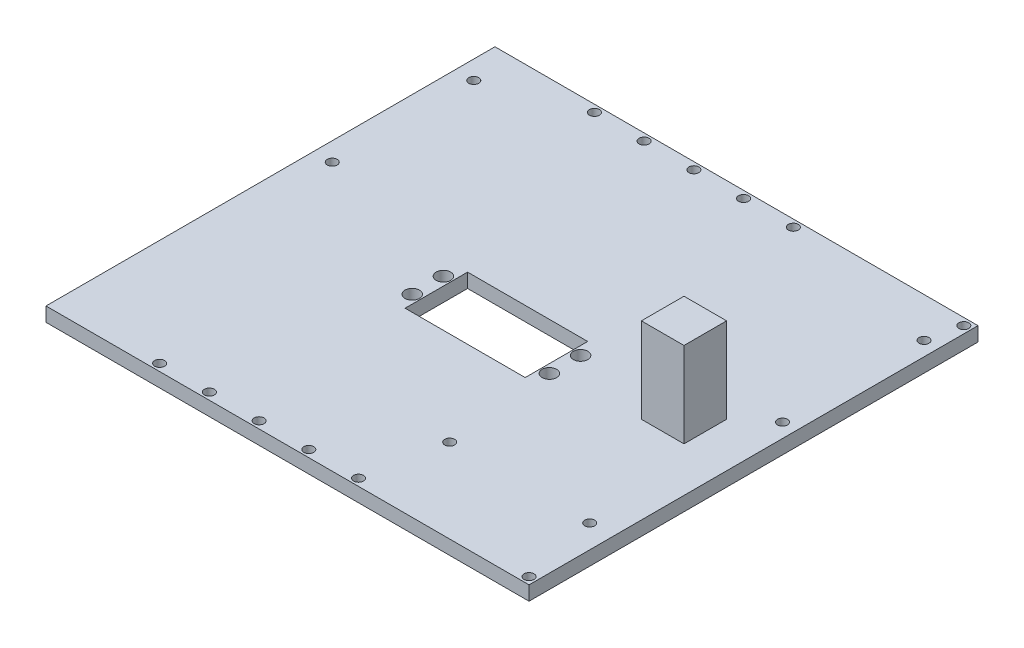
ISO-10303-21;
HEADER;
FILE_DESCRIPTION(('STEP AP214'),'2;1');
FILE_NAME('part.step','',(''),(''),'','','');
FILE_SCHEMA(('AUTOMOTIVE_DESIGN { 1 0 10303 214 1 1 1 1 }'));
ENDSEC;
DATA;
#1=APPLICATION_CONTEXT('core data for automotive mechanical design processes');
#2=APPLICATION_PROTOCOL_DEFINITION('international standard','automotive_design',2000,#1);
#3=PRODUCT_CONTEXT('',#1,'mechanical');
#4=PRODUCT('Part','Part','',(#3));
#5=PRODUCT_RELATED_PRODUCT_CATEGORY('part','',(#4));
#6=PRODUCT_DEFINITION_FORMATION('','',#4);
#7=PRODUCT_DEFINITION_CONTEXT('part definition',#1,'design');
#8=PRODUCT_DEFINITION('design','',#6,#7);
#9=PRODUCT_DEFINITION_SHAPE('','',#8);
#10=(LENGTH_UNIT() NAMED_UNIT(*) SI_UNIT(.MILLI.,.METRE.));
#11=(NAMED_UNIT(*) PLANE_ANGLE_UNIT() SI_UNIT($,.RADIAN.));
#12=(NAMED_UNIT(*) SI_UNIT($,.STERADIAN.) SOLID_ANGLE_UNIT());
#13=UNCERTAINTY_MEASURE_WITH_UNIT(LENGTH_MEASURE(1.E-05),#10,'distance_accuracy_value','');
#14=(GEOMETRIC_REPRESENTATION_CONTEXT(3) GLOBAL_UNCERTAINTY_ASSIGNED_CONTEXT((#13)) GLOBAL_UNIT_ASSIGNED_CONTEXT((#10,
#11,#12)) REPRESENTATION_CONTEXT('',''));
#15=CARTESIAN_POINT('',(0.,0.,0.));
#16=DIRECTION('',(0.,0.,1.));
#17=DIRECTION('',(1.,0.,0.));
#18=AXIS2_PLACEMENT_3D('',#15,#16,#17);
#19=CARTESIAN_POINT('',(0.,5.,0.));
#20=DIRECTION('',(0.,-1.,0.));
#21=DIRECTION('',(0.,0.,-1.));
#22=AXIS2_PLACEMENT_3D('',#19,#20,#21);
#23=PLANE('',#22);
#24=CARTESIAN_POINT('',(27.5411145274154,5.,49.4647128399208));
#25=DIRECTION('',(0.,1.,0.));
#26=DIRECTION('',(0.,0.,1.));
#27=AXIS2_PLACEMENT_3D('',#24,#25,#26);
#28=CIRCLE('',#27,1.75);
#29=CARTESIAN_POINT('',(27.5411145274154,5.,51.2147128399208));
#30=VERTEX_POINT('',#29);
#31=EDGE_CURVE('E146',#30,#30,#28,.T.);
#32=ORIENTED_EDGE('',*,*,#31,.F.);
#33=EDGE_LOOP('',(#32));
#34=FACE_BOUND('',#33,.T.);
#35=CARTESIAN_POINT('',(-78.46,5.,-65.));
#36=DIRECTION('',(0.,1.,0.));
#37=DIRECTION('',(0.,0.,1.));
#38=AXIS2_PLACEMENT_3D('',#35,#36,#37);
#39=CIRCLE('',#38,1.75);
#40=CARTESIAN_POINT('',(-78.46,5.,-63.25));
#41=VERTEX_POINT('',#40);
#42=EDGE_CURVE('E161',#41,#41,#39,.T.);
#43=ORIENTED_EDGE('',*,*,#42,.F.);
#44=EDGE_LOOP('',(#43));
#45=FACE_BOUND('',#44,.T.);
#46=CARTESIAN_POINT('',(80.,5.,-65.));
#47=DIRECTION('',(0.,1.,0.));
#48=DIRECTION('',(0.,0.,1.));
#49=AXIS2_PLACEMENT_3D('',#46,#47,#48);
#50=CIRCLE('',#49,1.75);
#51=CARTESIAN_POINT('',(80.,5.,-63.25));
#52=VERTEX_POINT('',#51);
#53=EDGE_CURVE('E198',#52,#52,#50,.T.);
#54=ORIENTED_EDGE('',*,*,#53,.F.);
#55=EDGE_LOOP('',(#54));
#56=FACE_BOUND('',#55,.T.);
#57=CARTESIAN_POINT('',(-24.13,5.,11.));
#58=DIRECTION('',(0.,1.,0.));
#59=DIRECTION('',(0.,0.,1.));
#60=AXIS2_PLACEMENT_3D('',#57,#58,#59);
#61=CIRCLE('',#60,2.54999999999999);
#62=CARTESIAN_POINT('',(-24.13,5.,13.55));
#63=VERTEX_POINT('',#62);
#64=EDGE_CURVE('E210',#63,#63,#61,.T.);
#65=ORIENTED_EDGE('',*,*,#64,.F.);
#66=EDGE_LOOP('',(#65));
#67=FACE_BOUND('',#66,.T.);
#68=CARTESIAN_POINT('',(24.14,5.,11.));
#69=DIRECTION('',(0.,1.,0.));
#70=DIRECTION('',(0.,0.,1.));
#71=AXIS2_PLACEMENT_3D('',#68,#69,#70);
#72=CIRCLE('',#71,2.54999999999999);
#73=CARTESIAN_POINT('',(24.14,5.,13.55));
#74=VERTEX_POINT('',#73);
#75=EDGE_CURVE('E222',#74,#74,#72,.T.);
#76=ORIENTED_EDGE('',*,*,#75,.F.);
#77=EDGE_LOOP('',(#76));
#78=FACE_BOUND('',#77,.T.);
#79=CARTESIAN_POINT('',(80.,5.,-15.2));
#80=DIRECTION('',(0.,1.,0.));
#81=DIRECTION('',(0.,0.,1.));
#82=AXIS2_PLACEMENT_3D('',#79,#80,#81);
#83=CIRCLE('',#82,1.75);
#84=CARTESIAN_POINT('',(80.,5.,-13.45));
#85=VERTEX_POINT('',#84);
#86=EDGE_CURVE('E234',#85,#85,#83,.T.);
#87=ORIENTED_EDGE('',*,*,#86,.F.);
#88=EDGE_LOOP('',(#87));
#89=FACE_BOUND('',#88,.T.);
#90=CARTESIAN_POINT('',(-29.9999999999984,5.,76.5000000000008));
#91=DIRECTION('',(0.,1.,0.));
#92=DIRECTION('',(0.,0.,1.));
#93=AXIS2_PLACEMENT_3D('',#90,#91,#92);
#94=CIRCLE('',#93,1.75);
#95=CARTESIAN_POINT('',(-29.9999999999984,5.,78.2500000000008));
#96=VERTEX_POINT('',#95);
#97=EDGE_CURVE('E246',#96,#96,#94,.T.);
#98=ORIENTED_EDGE('',*,*,#97,.F.);
#99=EDGE_LOOP('',(#98));
#100=FACE_BOUND('',#99,.T.);
#101=CARTESIAN_POINT('',(5.00000000000159,5.,76.5000000000005));
#102=DIRECTION('',(0.,1.,0.));
#103=DIRECTION('',(0.,0.,1.));
#104=AXIS2_PLACEMENT_3D('',#101,#102,#103);
#105=CIRCLE('',#104,1.75);
#106=CARTESIAN_POINT('',(5.00000000000159,5.,78.2500000000005));
#107=VERTEX_POINT('',#106);
#108=EDGE_CURVE('E258',#107,#107,#105,.T.);
#109=ORIENTED_EDGE('',*,*,#108,.F.);
#110=EDGE_LOOP('',(#109));
#111=FACE_BOUND('',#110,.T.);
#112=CARTESIAN_POINT('',(82.5000000000016,5.,76.5));
#113=DIRECTION('',(0.,1.,0.));
#114=DIRECTION('',(0.,0.,1.));
#115=AXIS2_PLACEMENT_3D('',#112,#113,#114);
#116=CIRCLE('',#115,1.75);
#117=CARTESIAN_POINT('',(82.5000000000016,5.,78.25));
#118=VERTEX_POINT('',#117);
#119=EDGE_CURVE('E270',#118,#118,#116,.T.);
#120=ORIENTED_EDGE('',*,*,#119,.F.);
#121=EDGE_LOOP('',(#120));
#122=FACE_BOUND('',#121,.T.);
#123=CARTESIAN_POINT('',(-30.,5.,-76.4999999999992));
#124=DIRECTION('',(0.,1.,0.));
#125=DIRECTION('',(0.,0.,1.));
#126=AXIS2_PLACEMENT_3D('',#123,#124,#125);
#127=CIRCLE('',#126,1.75);
#128=CARTESIAN_POINT('',(-30.,5.,-74.7499999999992));
#129=VERTEX_POINT('',#128);
#130=EDGE_CURVE('E282',#129,#129,#127,.T.);
#131=ORIENTED_EDGE('',*,*,#130,.F.);
#132=EDGE_LOOP('',(#131));
#133=FACE_BOUND('',#132,.T.);
#134=CARTESIAN_POINT('',(4.99999999999999,5.,-76.4999999999995));
#135=DIRECTION('',(0.,1.,0.));
#136=DIRECTION('',(0.,0.,1.));
#137=AXIS2_PLACEMENT_3D('',#134,#135,#136);
#138=CIRCLE('',#137,1.75);
#139=CARTESIAN_POINT('',(4.99999999999999,5.,-74.7499999999995));
#140=VERTEX_POINT('',#139);
#141=EDGE_CURVE('E294',#140,#140,#138,.T.);
#142=ORIENTED_EDGE('',*,*,#141,.F.);
#143=EDGE_LOOP('',(#142));
#144=FACE_BOUND('',#143,.T.);
#145=CARTESIAN_POINT('',(82.5,5.,-76.5));
#146=DIRECTION('',(0.,1.,0.));
#147=DIRECTION('',(0.,0.,1.));
#148=AXIS2_PLACEMENT_3D('',#145,#146,#147);
#149=CIRCLE('',#148,1.75);
#150=CARTESIAN_POINT('',(82.5,5.,-74.75));
#151=VERTEX_POINT('',#150);
#152=EDGE_CURVE('E306',#151,#151,#149,.T.);
#153=ORIENTED_EDGE('',*,*,#152,.F.);
#154=EDGE_LOOP('',(#153));
#155=FACE_BOUND('',#154,.T.);
#156=DIRECTION('',(0.,0.,-1.));
#157=VECTOR('',#156,1.);
#158=CARTESIAN_POINT('',(85.,5.,79.));
#159=LINE('',#158,#157);
#160=CARTESIAN_POINT('',(85.,5.,79.));
#161=VERTEX_POINT('',#160);
#162=CARTESIAN_POINT('',(85.,5.,-79.));
#163=VERTEX_POINT('',#162);
#164=EDGE_CURVE('E312',#161,#163,#159,.T.);
#165=ORIENTED_EDGE('',*,*,#164,.T.);
#166=DIRECTION('',(-1.,0.,0.));
#167=VECTOR('',#166,1.);
#168=CARTESIAN_POINT('',(-85.,5.,-79.));
#169=LINE('',#168,#167);
#170=CARTESIAN_POINT('',(-85.,5.,-79.));
#171=VERTEX_POINT('',#170);
#172=EDGE_CURVE('E315',#163,#171,#169,.T.);
#173=ORIENTED_EDGE('',*,*,#172,.T.);
#174=DIRECTION('',(0.,0.,1.));
#175=VECTOR('',#174,1.);
#176=CARTESIAN_POINT('',(-85.,5.,79.));
#177=LINE('',#176,#175);
#178=CARTESIAN_POINT('',(-85.,5.,79.));
#179=VERTEX_POINT('',#178);
#180=EDGE_CURVE('E318',#171,#179,#177,.T.);
#181=ORIENTED_EDGE('',*,*,#180,.T.);
#182=DIRECTION('',(1.,0.,0.));
#183=VECTOR('',#182,1.);
#184=CARTESIAN_POINT('',(-85.,5.,79.));
#185=LINE('',#184,#183);
#186=EDGE_CURVE('E320',#179,#161,#185,.T.);
#187=ORIENTED_EDGE('',*,*,#186,.T.);
#188=EDGE_LOOP('',(#165,#173,#181,#187));
#189=FACE_BOUND('',#188,.T.);
#190=CARTESIAN_POINT('',(22.5,5.,-76.4999999999996));
#191=DIRECTION('',(0.,1.,0.));
#192=DIRECTION('',(0.,0.,1.));
#193=AXIS2_PLACEMENT_3D('',#190,#191,#192);
#194=CIRCLE('',#193,1.75);
#195=CARTESIAN_POINT('',(22.5,5.,-74.7499999999996));
#196=VERTEX_POINT('',#195);
#197=EDGE_CURVE('E300',#196,#196,#194,.T.);
#198=ORIENTED_EDGE('',*,*,#197,.F.);
#199=EDGE_LOOP('',(#198));
#200=FACE_BOUND('',#199,.T.);
#201=CARTESIAN_POINT('',(-12.5,5.,-76.4999999999993));
#202=DIRECTION('',(0.,1.,0.));
#203=DIRECTION('',(0.,0.,1.));
#204=AXIS2_PLACEMENT_3D('',#201,#202,#203);
#205=CIRCLE('',#204,1.75);
#206=CARTESIAN_POINT('',(-12.5,5.,-74.7499999999993));
#207=VERTEX_POINT('',#206);
#208=EDGE_CURVE('E288',#207,#207,#205,.T.);
#209=ORIENTED_EDGE('',*,*,#208,.F.);
#210=EDGE_LOOP('',(#209));
#211=FACE_BOUND('',#210,.T.);
#212=CARTESIAN_POINT('',(-47.5,5.,-76.4999999999991));
#213=DIRECTION('',(0.,1.,0.));
#214=DIRECTION('',(0.,0.,1.));
#215=AXIS2_PLACEMENT_3D('',#212,#213,#214);
#216=CIRCLE('',#215,1.75);
#217=CARTESIAN_POINT('',(-47.5,5.,-74.7499999999991));
#218=VERTEX_POINT('',#217);
#219=EDGE_CURVE('E276',#218,#218,#216,.T.);
#220=ORIENTED_EDGE('',*,*,#219,.F.);
#221=EDGE_LOOP('',(#220));
#222=FACE_BOUND('',#221,.T.);
#223=CARTESIAN_POINT('',(22.5000000000016,5.,76.5000000000004));
#224=DIRECTION('',(0.,1.,0.));
#225=DIRECTION('',(0.,0.,1.));
#226=AXIS2_PLACEMENT_3D('',#223,#224,#225);
#227=CIRCLE('',#226,1.75);
#228=CARTESIAN_POINT('',(22.5000000000016,5.,78.2500000000004));
#229=VERTEX_POINT('',#228);
#230=EDGE_CURVE('E264',#229,#229,#227,.T.);
#231=ORIENTED_EDGE('',*,*,#230,.F.);
#232=EDGE_LOOP('',(#231));
#233=FACE_BOUND('',#232,.T.);
#234=CARTESIAN_POINT('',(-12.4999999999984,5.,76.5000000000007));
#235=DIRECTION('',(0.,1.,0.));
#236=DIRECTION('',(0.,0.,1.));
#237=AXIS2_PLACEMENT_3D('',#234,#235,#236);
#238=CIRCLE('',#237,1.75);
#239=CARTESIAN_POINT('',(-12.4999999999984,5.,78.2500000000007));
#240=VERTEX_POINT('',#239);
#241=EDGE_CURVE('E252',#240,#240,#238,.T.);
#242=ORIENTED_EDGE('',*,*,#241,.F.);
#243=EDGE_LOOP('',(#242));
#244=FACE_BOUND('',#243,.T.);
#245=CARTESIAN_POINT('',(-47.4999999999984,5.,76.5000000000009));
#246=DIRECTION('',(0.,1.,0.));
#247=DIRECTION('',(0.,0.,1.));
#248=AXIS2_PLACEMENT_3D('',#245,#246,#247);
#249=CIRCLE('',#248,1.75);
#250=CARTESIAN_POINT('',(-47.4999999999984,5.,78.2500000000009));
#251=VERTEX_POINT('',#250);
#252=EDGE_CURVE('E240',#251,#251,#249,.T.);
#253=ORIENTED_EDGE('',*,*,#252,.F.);
#254=EDGE_LOOP('',(#253));
#255=FACE_BOUND('',#254,.T.);
#256=CARTESIAN_POINT('',(-78.46,5.,-15.2));
#257=DIRECTION('',(0.,1.,0.));
#258=DIRECTION('',(0.,0.,1.));
#259=AXIS2_PLACEMENT_3D('',#256,#257,#258);
#260=CIRCLE('',#259,1.75);
#261=CARTESIAN_POINT('',(-78.46,5.,-13.45));
#262=VERTEX_POINT('',#261);
#263=EDGE_CURVE('E228',#262,#262,#260,.T.);
#264=ORIENTED_EDGE('',*,*,#263,.F.);
#265=EDGE_LOOP('',(#264));
#266=FACE_BOUND('',#265,.T.);
#267=CARTESIAN_POINT('',(24.14,5.,0.));
#268=DIRECTION('',(0.,1.,0.));
#269=DIRECTION('',(0.,0.,1.));
#270=AXIS2_PLACEMENT_3D('',#267,#268,#269);
#271=CIRCLE('',#270,2.54999999999999);
#272=CARTESIAN_POINT('',(24.14,5.,2.54999999999999));
#273=VERTEX_POINT('',#272);
#274=EDGE_CURVE('E216',#273,#273,#271,.T.);
#275=ORIENTED_EDGE('',*,*,#274,.F.);
#276=EDGE_LOOP('',(#275));
#277=FACE_BOUND('',#276,.T.);
#278=CARTESIAN_POINT('',(-24.13,5.,0.));
#279=DIRECTION('',(0.,1.,0.));
#280=DIRECTION('',(0.,0.,1.));
#281=AXIS2_PLACEMENT_3D('',#278,#279,#280);
#282=CIRCLE('',#281,2.54999999999999);
#283=CARTESIAN_POINT('',(-24.13,5.,2.55000000000002));
#284=VERTEX_POINT('',#283);
#285=EDGE_CURVE('E204',#284,#284,#282,.T.);
#286=ORIENTED_EDGE('',*,*,#285,.F.);
#287=EDGE_LOOP('',(#286));
#288=FACE_BOUND('',#287,.T.);
#289=DIRECTION('',(0.,0.,-1.));
#290=VECTOR('',#289,1.);
#291=CARTESIAN_POINT('',(21.14,5.,16.5));
#292=LINE('',#291,#290);
#293=CARTESIAN_POINT('',(21.14,5.,16.5));
#294=VERTEX_POINT('',#293);
#295=CARTESIAN_POINT('',(21.14,5.,-5.5));
#296=VERTEX_POINT('',#295);
#297=EDGE_CURVE('E167',#294,#296,#292,.T.);
#298=ORIENTED_EDGE('',*,*,#297,.F.);
#299=DIRECTION('',(1.,0.,0.));
#300=VECTOR('',#299,1.);
#301=CARTESIAN_POINT('',(-21.13,5.,16.5));
#302=LINE('',#301,#300);
#303=CARTESIAN_POINT('',(-21.13,5.,16.5));
#304=VERTEX_POINT('',#303);
#305=EDGE_CURVE('E175',#304,#294,#302,.T.);
#306=ORIENTED_EDGE('',*,*,#305,.F.);
#307=DIRECTION('',(0.,0.,1.));
#308=VECTOR('',#307,1.);
#309=CARTESIAN_POINT('',(-21.13,5.,16.5));
#310=LINE('',#309,#308);
#311=CARTESIAN_POINT('',(-21.13,5.,-5.5));
#312=VERTEX_POINT('',#311);
#313=EDGE_CURVE('E172',#312,#304,#310,.T.);
#314=ORIENTED_EDGE('',*,*,#313,.F.);
#315=DIRECTION('',(-1.,0.,0.));
#316=VECTOR('',#315,1.);
#317=CARTESIAN_POINT('',(-21.13,5.,-5.5));
#318=LINE('',#317,#316);
#319=EDGE_CURVE('E169',#296,#312,#318,.T.);
#320=ORIENTED_EDGE('',*,*,#319,.F.);
#321=EDGE_LOOP('',(#298,#306,#314,#320));
#322=FACE_BOUND('',#321,.T.);
#323=CARTESIAN_POINT('',(76.8111145274154,5.,49.4647128399208));
#324=DIRECTION('',(0.,1.,0.));
#325=DIRECTION('',(0.,0.,1.));
#326=AXIS2_PLACEMENT_3D('',#323,#324,#325);
#327=CIRCLE('',#326,1.75);
#328=CARTESIAN_POINT('',(76.8111145274154,5.,51.2147128399208));
#329=VERTEX_POINT('',#328);
#330=EDGE_CURVE('E155',#329,#329,#327,.T.);
#331=ORIENTED_EDGE('',*,*,#330,.F.);
#332=EDGE_LOOP('',(#331));
#333=FACE_BOUND('',#332,.T.);
#334=DIRECTION('',(0.,0.,-1.));
#335=VECTOR('',#334,1.);
#336=CARTESIAN_POINT('',(69.3003238288719,5.,-6.22923014712683));
#337=LINE('',#336,#335);
#338=CARTESIAN_POINT('',(69.3003238288719,5.,8.77076985287317));
#339=VERTEX_POINT('',#338);
#340=CARTESIAN_POINT('',(69.3003238288719,5.,-6.22923014712683));
#341=VERTEX_POINT('',#340);
#342=EDGE_CURVE('E142',#339,#341,#337,.T.);
#343=ORIENTED_EDGE('',*,*,#342,.F.);
#344=DIRECTION('',(1.,0.,0.));
#345=VECTOR('',#344,1.);
#346=CARTESIAN_POINT('',(54.3003238288719,5.,8.77076985287317));
#347=LINE('',#346,#345);
#348=CARTESIAN_POINT('',(54.3003238288719,5.,8.77076985287317));
#349=VERTEX_POINT('',#348);
#350=EDGE_CURVE('E139',#349,#339,#347,.T.);
#351=ORIENTED_EDGE('',*,*,#350,.F.);
#352=DIRECTION('',(0.,0.,1.));
#353=VECTOR('',#352,1.);
#354=CARTESIAN_POINT('',(54.3003238288719,5.,-6.22923014712683));
#355=LINE('',#354,#353);
#356=CARTESIAN_POINT('',(54.3003238288719,5.,-6.22923014712683));
#357=VERTEX_POINT('',#356);
#358=EDGE_CURVE('E53',#357,#349,#355,.T.);
#359=ORIENTED_EDGE('',*,*,#358,.F.);
#360=DIRECTION('',(-1.,0.,0.));
#361=VECTOR('',#360,1.);
#362=CARTESIAN_POINT('',(54.3003238288719,5.,-6.22923014712683));
#363=LINE('',#362,#361);
#364=EDGE_CURVE('E48',#341,#357,#363,.T.);
#365=ORIENTED_EDGE('',*,*,#364,.F.);
#366=EDGE_LOOP('',(#343,#351,#359,#365));
#367=FACE_BOUND('',#366,.T.);
#368=ADVANCED_FACE('F33',(#34,#45,#56,#67,#78,#89,#100,#111,#122,#133,#144,#155,#189,#200,#211,
#222,#233,#244,#255,#266,#277,#288,#322,#333,#367),#23,.F.);
#369=CARTESIAN_POINT('',(0.,0.,0.));
#370=DIRECTION('',(0.,-1.,0.));
#371=DIRECTION('',(0.,0.,-1.));
#372=AXIS2_PLACEMENT_3D('',#369,#370,#371);
#373=PLANE('',#372);
#374=CARTESIAN_POINT('',(76.8111145274154,0.,49.4647128399208));
#375=DIRECTION('',(0.,1.,0.));
#376=DIRECTION('',(0.,0.,1.));
#377=AXIS2_PLACEMENT_3D('',#374,#375,#376);
#378=CIRCLE('',#377,1.75);
#379=CARTESIAN_POINT('',(76.8111145274154,0.,51.2147128399208));
#380=VERTEX_POINT('',#379);
#381=EDGE_CURVE('E153',#380,#380,#378,.T.);
#382=ORIENTED_EDGE('',*,*,#381,.T.);
#383=EDGE_LOOP('',(#382));
#384=FACE_BOUND('',#383,.T.);
#385=DIRECTION('',(1.,0.,0.));
#386=VECTOR('',#385,1.);
#387=CARTESIAN_POINT('',(-21.13,0.,16.5));
#388=LINE('',#387,#386);
#389=CARTESIAN_POINT('',(-21.13,0.,16.5));
#390=VERTEX_POINT('',#389);
#391=CARTESIAN_POINT('',(21.14,0.,16.5));
#392=VERTEX_POINT('',#391);
#393=EDGE_CURVE('E170',#390,#392,#388,.T.);
#394=ORIENTED_EDGE('',*,*,#393,.T.);
#395=DIRECTION('',(0.,0.,-1.));
#396=VECTOR('',#395,1.);
#397=CARTESIAN_POINT('',(21.14,0.,16.5));
#398=LINE('',#397,#396);
#399=CARTESIAN_POINT('',(21.14,0.,-5.5));
#400=VERTEX_POINT('',#399);
#401=EDGE_CURVE('E164',#392,#400,#398,.T.);
#402=ORIENTED_EDGE('',*,*,#401,.T.);
#403=DIRECTION('',(-1.,0.,0.));
#404=VECTOR('',#403,1.);
#405=CARTESIAN_POINT('',(-21.13,0.,-5.5));
#406=LINE('',#405,#404);
#407=CARTESIAN_POINT('',(-21.13,0.,-5.5));
#408=VERTEX_POINT('',#407);
#409=EDGE_CURVE('E180',#400,#408,#406,.T.);
#410=ORIENTED_EDGE('',*,*,#409,.T.);
#411=DIRECTION('',(0.,0.,1.));
#412=VECTOR('',#411,1.);
#413=CARTESIAN_POINT('',(-21.13,0.,16.5));
#414=LINE('',#413,#412);
#415=EDGE_CURVE('E183',#408,#390,#414,.T.);
#416=ORIENTED_EDGE('',*,*,#415,.T.);
#417=EDGE_LOOP('',(#394,#402,#410,#416));
#418=FACE_BOUND('',#417,.T.);
#419=CARTESIAN_POINT('',(-24.13,0.,0.));
#420=DIRECTION('',(0.,1.,0.));
#421=DIRECTION('',(0.,0.,1.));
#422=AXIS2_PLACEMENT_3D('',#419,#420,#421);
#423=CIRCLE('',#422,2.54999999999999);
#424=CARTESIAN_POINT('',(-24.13,0.,2.55000000000002));
#425=VERTEX_POINT('',#424);
#426=EDGE_CURVE('E201',#425,#425,#423,.T.);
#427=ORIENTED_EDGE('',*,*,#426,.T.);
#428=EDGE_LOOP('',(#427));
#429=FACE_BOUND('',#428,.T.);
#430=CARTESIAN_POINT('',(24.14,0.,0.));
#431=DIRECTION('',(0.,1.,0.));
#432=DIRECTION('',(0.,0.,1.));
#433=AXIS2_PLACEMENT_3D('',#430,#431,#432);
#434=CIRCLE('',#433,2.54999999999999);
#435=CARTESIAN_POINT('',(24.14,0.,2.54999999999999));
#436=VERTEX_POINT('',#435);
#437=EDGE_CURVE('E213',#436,#436,#434,.T.);
#438=ORIENTED_EDGE('',*,*,#437,.T.);
#439=EDGE_LOOP('',(#438));
#440=FACE_BOUND('',#439,.T.);
#441=CARTESIAN_POINT('',(-78.46,0.,-15.2));
#442=DIRECTION('',(0.,1.,0.));
#443=DIRECTION('',(0.,0.,1.));
#444=AXIS2_PLACEMENT_3D('',#441,#442,#443);
#445=CIRCLE('',#444,1.75);
#446=CARTESIAN_POINT('',(-78.46,0.,-13.45));
#447=VERTEX_POINT('',#446);
#448=EDGE_CURVE('E225',#447,#447,#445,.T.);
#449=ORIENTED_EDGE('',*,*,#448,.T.);
#450=EDGE_LOOP('',(#449));
#451=FACE_BOUND('',#450,.T.);
#452=CARTESIAN_POINT('',(-47.4999999999984,0.,76.5000000000009));
#453=DIRECTION('',(0.,1.,0.));
#454=DIRECTION('',(0.,0.,1.));
#455=AXIS2_PLACEMENT_3D('',#452,#453,#454);
#456=CIRCLE('',#455,1.75);
#457=CARTESIAN_POINT('',(-47.4999999999984,0.,78.2500000000009));
#458=VERTEX_POINT('',#457);
#459=EDGE_CURVE('E237',#458,#458,#456,.T.);
#460=ORIENTED_EDGE('',*,*,#459,.T.);
#461=EDGE_LOOP('',(#460));
#462=FACE_BOUND('',#461,.T.);
#463=CARTESIAN_POINT('',(-12.4999999999984,0.,76.5000000000007));
#464=DIRECTION('',(0.,1.,0.));
#465=DIRECTION('',(0.,0.,1.));
#466=AXIS2_PLACEMENT_3D('',#463,#464,#465);
#467=CIRCLE('',#466,1.75);
#468=CARTESIAN_POINT('',(-12.4999999999984,0.,78.2500000000007));
#469=VERTEX_POINT('',#468);
#470=EDGE_CURVE('E249',#469,#469,#467,.T.);
#471=ORIENTED_EDGE('',*,*,#470,.T.);
#472=EDGE_LOOP('',(#471));
#473=FACE_BOUND('',#472,.T.);
#474=CARTESIAN_POINT('',(22.5000000000016,0.,76.5000000000004));
#475=DIRECTION('',(0.,1.,0.));
#476=DIRECTION('',(0.,0.,1.));
#477=AXIS2_PLACEMENT_3D('',#474,#475,#476);
#478=CIRCLE('',#477,1.75);
#479=CARTESIAN_POINT('',(22.5000000000016,0.,78.2500000000004));
#480=VERTEX_POINT('',#479);
#481=EDGE_CURVE('E261',#480,#480,#478,.T.);
#482=ORIENTED_EDGE('',*,*,#481,.T.);
#483=EDGE_LOOP('',(#482));
#484=FACE_BOUND('',#483,.T.);
#485=CARTESIAN_POINT('',(-47.5,0.,-76.4999999999991));
#486=DIRECTION('',(0.,1.,0.));
#487=DIRECTION('',(0.,0.,1.));
#488=AXIS2_PLACEMENT_3D('',#485,#486,#487);
#489=CIRCLE('',#488,1.75);
#490=CARTESIAN_POINT('',(-47.5,0.,-74.7499999999991));
#491=VERTEX_POINT('',#490);
#492=EDGE_CURVE('E273',#491,#491,#489,.T.);
#493=ORIENTED_EDGE('',*,*,#492,.T.);
#494=EDGE_LOOP('',(#493));
#495=FACE_BOUND('',#494,.T.);
#496=CARTESIAN_POINT('',(-12.5,0.,-76.4999999999993));
#497=DIRECTION('',(0.,1.,0.));
#498=DIRECTION('',(0.,0.,1.));
#499=AXIS2_PLACEMENT_3D('',#496,#497,#498);
#500=CIRCLE('',#499,1.75);
#501=CARTESIAN_POINT('',(-12.5,0.,-74.7499999999993));
#502=VERTEX_POINT('',#501);
#503=EDGE_CURVE('E285',#502,#502,#500,.T.);
#504=ORIENTED_EDGE('',*,*,#503,.T.);
#505=EDGE_LOOP('',(#504));
#506=FACE_BOUND('',#505,.T.);
#507=CARTESIAN_POINT('',(22.5,0.,-76.4999999999996));
#508=DIRECTION('',(0.,1.,0.));
#509=DIRECTION('',(0.,0.,1.));
#510=AXIS2_PLACEMENT_3D('',#507,#508,#509);
#511=CIRCLE('',#510,1.75);
#512=CARTESIAN_POINT('',(22.5,0.,-74.7499999999996));
#513=VERTEX_POINT('',#512);
#514=EDGE_CURVE('E297',#513,#513,#511,.T.);
#515=ORIENTED_EDGE('',*,*,#514,.T.);
#516=EDGE_LOOP('',(#515));
#517=FACE_BOUND('',#516,.T.);
#518=DIRECTION('',(0.,0.,-1.));
#519=VECTOR('',#518,1.);
#520=CARTESIAN_POINT('',(85.,0.,79.));
#521=LINE('',#520,#519);
#522=CARTESIAN_POINT('',(85.,0.,79.));
#523=VERTEX_POINT('',#522);
#524=CARTESIAN_POINT('',(85.,0.,-79.));
#525=VERTEX_POINT('',#524);
#526=EDGE_CURVE('E309',#523,#525,#521,.T.);
#527=ORIENTED_EDGE('',*,*,#526,.F.);
#528=DIRECTION('',(1.,0.,0.));
#529=VECTOR('',#528,1.);
#530=CARTESIAN_POINT('',(-85.,0.,79.));
#531=LINE('',#530,#529);
#532=CARTESIAN_POINT('',(-85.,0.,79.));
#533=VERTEX_POINT('',#532);
#534=EDGE_CURVE('E316',#533,#523,#531,.T.);
#535=ORIENTED_EDGE('',*,*,#534,.F.);
#536=DIRECTION('',(0.,0.,1.));
#537=VECTOR('',#536,1.);
#538=CARTESIAN_POINT('',(-85.,0.,79.));
#539=LINE('',#538,#537);
#540=CARTESIAN_POINT('',(-85.,0.,-79.));
#541=VERTEX_POINT('',#540);
#542=EDGE_CURVE('E327',#541,#533,#539,.T.);
#543=ORIENTED_EDGE('',*,*,#542,.F.);
#544=DIRECTION('',(-1.,0.,0.));
#545=VECTOR('',#544,1.);
#546=CARTESIAN_POINT('',(-85.,0.,-79.));
#547=LINE('',#546,#545);
#548=EDGE_CURVE('E325',#525,#541,#547,.T.);
#549=ORIENTED_EDGE('',*,*,#548,.F.);
#550=EDGE_LOOP('',(#527,#535,#543,#549));
#551=FACE_BOUND('',#550,.T.);
#552=CARTESIAN_POINT('',(82.5,0.,-76.5));
#553=DIRECTION('',(0.,1.,0.));
#554=DIRECTION('',(0.,0.,1.));
#555=AXIS2_PLACEMENT_3D('',#552,#553,#554);
#556=CIRCLE('',#555,1.75);
#557=CARTESIAN_POINT('',(82.5,0.,-74.75));
#558=VERTEX_POINT('',#557);
#559=EDGE_CURVE('E303',#558,#558,#556,.T.);
#560=ORIENTED_EDGE('',*,*,#559,.T.);
#561=EDGE_LOOP('',(#560));
#562=FACE_BOUND('',#561,.T.);
#563=CARTESIAN_POINT('',(4.99999999999999,0.,-76.4999999999995));
#564=DIRECTION('',(0.,1.,0.));
#565=DIRECTION('',(0.,0.,1.));
#566=AXIS2_PLACEMENT_3D('',#563,#564,#565);
#567=CIRCLE('',#566,1.75);
#568=CARTESIAN_POINT('',(4.99999999999999,0.,-74.7499999999995));
#569=VERTEX_POINT('',#568);
#570=EDGE_CURVE('E291',#569,#569,#567,.T.);
#571=ORIENTED_EDGE('',*,*,#570,.T.);
#572=EDGE_LOOP('',(#571));
#573=FACE_BOUND('',#572,.T.);
#574=CARTESIAN_POINT('',(-30.,0.,-76.4999999999992));
#575=DIRECTION('',(0.,1.,0.));
#576=DIRECTION('',(0.,0.,1.));
#577=AXIS2_PLACEMENT_3D('',#574,#575,#576);
#578=CIRCLE('',#577,1.75);
#579=CARTESIAN_POINT('',(-30.,0.,-74.7499999999992));
#580=VERTEX_POINT('',#579);
#581=EDGE_CURVE('E279',#580,#580,#578,.T.);
#582=ORIENTED_EDGE('',*,*,#581,.T.);
#583=EDGE_LOOP('',(#582));
#584=FACE_BOUND('',#583,.T.);
#585=CARTESIAN_POINT('',(82.5000000000016,0.,76.5));
#586=DIRECTION('',(0.,1.,0.));
#587=DIRECTION('',(0.,0.,1.));
#588=AXIS2_PLACEMENT_3D('',#585,#586,#587);
#589=CIRCLE('',#588,1.75);
#590=CARTESIAN_POINT('',(82.5000000000016,0.,78.25));
#591=VERTEX_POINT('',#590);
#592=EDGE_CURVE('E267',#591,#591,#589,.T.);
#593=ORIENTED_EDGE('',*,*,#592,.T.);
#594=EDGE_LOOP('',(#593));
#595=FACE_BOUND('',#594,.T.);
#596=CARTESIAN_POINT('',(5.00000000000159,0.,76.5000000000005));
#597=DIRECTION('',(0.,1.,0.));
#598=DIRECTION('',(0.,0.,1.));
#599=AXIS2_PLACEMENT_3D('',#596,#597,#598);
#600=CIRCLE('',#599,1.75);
#601=CARTESIAN_POINT('',(5.00000000000159,0.,78.2500000000005));
#602=VERTEX_POINT('',#601);
#603=EDGE_CURVE('E255',#602,#602,#600,.T.);
#604=ORIENTED_EDGE('',*,*,#603,.T.);
#605=EDGE_LOOP('',(#604));
#606=FACE_BOUND('',#605,.T.);
#607=CARTESIAN_POINT('',(-29.9999999999984,0.,76.5000000000008));
#608=DIRECTION('',(0.,1.,0.));
#609=DIRECTION('',(0.,0.,1.));
#610=AXIS2_PLACEMENT_3D('',#607,#608,#609);
#611=CIRCLE('',#610,1.75);
#612=CARTESIAN_POINT('',(-29.9999999999984,0.,78.2500000000008));
#613=VERTEX_POINT('',#612);
#614=EDGE_CURVE('E243',#613,#613,#611,.T.);
#615=ORIENTED_EDGE('',*,*,#614,.T.);
#616=EDGE_LOOP('',(#615));
#617=FACE_BOUND('',#616,.T.);
#618=CARTESIAN_POINT('',(80.,0.,-15.2));
#619=DIRECTION('',(0.,1.,0.));
#620=DIRECTION('',(0.,0.,1.));
#621=AXIS2_PLACEMENT_3D('',#618,#619,#620);
#622=CIRCLE('',#621,1.75);
#623=CARTESIAN_POINT('',(80.,0.,-13.45));
#624=VERTEX_POINT('',#623);
#625=EDGE_CURVE('E231',#624,#624,#622,.T.);
#626=ORIENTED_EDGE('',*,*,#625,.T.);
#627=EDGE_LOOP('',(#626));
#628=FACE_BOUND('',#627,.T.);
#629=CARTESIAN_POINT('',(24.14,0.,11.));
#630=DIRECTION('',(0.,1.,0.));
#631=DIRECTION('',(0.,0.,1.));
#632=AXIS2_PLACEMENT_3D('',#629,#630,#631);
#633=CIRCLE('',#632,2.54999999999999);
#634=CARTESIAN_POINT('',(24.14,0.,13.55));
#635=VERTEX_POINT('',#634);
#636=EDGE_CURVE('E219',#635,#635,#633,.T.);
#637=ORIENTED_EDGE('',*,*,#636,.T.);
#638=EDGE_LOOP('',(#637));
#639=FACE_BOUND('',#638,.T.);
#640=CARTESIAN_POINT('',(-24.13,0.,11.));
#641=DIRECTION('',(0.,1.,0.));
#642=DIRECTION('',(0.,0.,1.));
#643=AXIS2_PLACEMENT_3D('',#640,#641,#642);
#644=CIRCLE('',#643,2.54999999999999);
#645=CARTESIAN_POINT('',(-24.13,0.,13.55));
#646=VERTEX_POINT('',#645);
#647=EDGE_CURVE('E207',#646,#646,#644,.T.);
#648=ORIENTED_EDGE('',*,*,#647,.T.);
#649=EDGE_LOOP('',(#648));
#650=FACE_BOUND('',#649,.T.);
#651=CARTESIAN_POINT('',(80.,0.,-65.));
#652=DIRECTION('',(0.,1.,0.));
#653=DIRECTION('',(0.,0.,1.));
#654=AXIS2_PLACEMENT_3D('',#651,#652,#653);
#655=CIRCLE('',#654,1.75);
#656=CARTESIAN_POINT('',(80.,0.,-63.25));
#657=VERTEX_POINT('',#656);
#658=EDGE_CURVE('E197',#657,#657,#655,.T.);
#659=ORIENTED_EDGE('',*,*,#658,.T.);
#660=EDGE_LOOP('',(#659));
#661=FACE_BOUND('',#660,.T.);
#662=CARTESIAN_POINT('',(-78.46,0.,-65.));
#663=DIRECTION('',(0.,1.,0.));
#664=DIRECTION('',(0.,0.,1.));
#665=AXIS2_PLACEMENT_3D('',#662,#663,#664);
#666=CIRCLE('',#665,1.75);
#667=CARTESIAN_POINT('',(-78.46,0.,-63.25));
#668=VERTEX_POINT('',#667);
#669=EDGE_CURVE('E158',#668,#668,#666,.T.);
#670=ORIENTED_EDGE('',*,*,#669,.T.);
#671=EDGE_LOOP('',(#670));
#672=FACE_BOUND('',#671,.T.);
#673=CARTESIAN_POINT('',(27.5411145274154,0.,49.4647128399208));
#674=DIRECTION('',(0.,1.,0.));
#675=DIRECTION('',(0.,0.,1.));
#676=AXIS2_PLACEMENT_3D('',#673,#674,#675);
#677=CIRCLE('',#676,1.75);
#678=CARTESIAN_POINT('',(27.5411145274154,0.,51.2147128399208));
#679=VERTEX_POINT('',#678);
#680=EDGE_CURVE('E143',#679,#679,#677,.T.);
#681=ORIENTED_EDGE('',*,*,#680,.T.);
#682=EDGE_LOOP('',(#681));
#683=FACE_BOUND('',#682,.T.);
#684=ADVANCED_FACE('F345',(#384,#418,#429,#440,#451,#462,#473,#484,#495,#506,#517,#551,#562,
#573,#584,#595,#606,#617,#628,#639,#650,#661,#672,#683),#373,.T.);
#685=CARTESIAN_POINT('',(85.,5.,79.));
#686=DIRECTION('',(-1.,0.,0.));
#687=DIRECTION('',(0.,0.,1.));
#688=AXIS2_PLACEMENT_3D('',#685,#686,#687);
#689=PLANE('',#688);
#690=ORIENTED_EDGE('',*,*,#526,.T.);
#691=DIRECTION('',(0.,-1.,0.));
#692=VECTOR('',#691,1.);
#693=CARTESIAN_POINT('',(85.,5.,-79.));
#694=LINE('',#693,#692);
#695=EDGE_CURVE('E11',#163,#525,#694,.T.);
#696=ORIENTED_EDGE('',*,*,#695,.F.);
#697=ORIENTED_EDGE('',*,*,#164,.F.);
#698=DIRECTION('',(0.,-1.,0.));
#699=VECTOR('',#698,1.);
#700=CARTESIAN_POINT('',(85.,5.,79.));
#701=LINE('',#700,#699);
#702=EDGE_CURVE('E322',#161,#523,#701,.T.);
#703=ORIENTED_EDGE('',*,*,#702,.T.);
#704=EDGE_LOOP('',(#690,#696,#697,#703));
#705=FACE_BOUND('',#704,.T.);
#706=ADVANCED_FACE('F35',(#705),#689,.F.);
#707=CARTESIAN_POINT('',(-85.,5.,-79.));
#708=DIRECTION('',(0.,0.,1.));
#709=DIRECTION('',(1.,0.,0.));
#710=AXIS2_PLACEMENT_3D('',#707,#708,#709);
#711=PLANE('',#710);
#712=ORIENTED_EDGE('',*,*,#548,.T.);
#713=DIRECTION('',(0.,-1.,0.));
#714=VECTOR('',#713,1.);
#715=CARTESIAN_POINT('',(-85.,5.,-79.));
#716=LINE('',#715,#714);
#717=EDGE_CURVE('E41',#171,#541,#716,.T.);
#718=ORIENTED_EDGE('',*,*,#717,.F.);
#719=ORIENTED_EDGE('',*,*,#172,.F.);
#720=ORIENTED_EDGE('',*,*,#695,.T.);
#721=EDGE_LOOP('',(#712,#718,#719,#720));
#722=FACE_BOUND('',#721,.T.);
#723=ADVANCED_FACE('F356',(#722),#711,.F.);
#724=CARTESIAN_POINT('',(-85.,5.,79.));
#725=DIRECTION('',(1.,0.,0.));
#726=DIRECTION('',(0.,0.,-1.));
#727=AXIS2_PLACEMENT_3D('',#724,#725,#726);
#728=PLANE('',#727);
#729=ORIENTED_EDGE('',*,*,#542,.T.);
#730=DIRECTION('',(0.,-1.,0.));
#731=VECTOR('',#730,1.);
#732=CARTESIAN_POINT('',(-85.,5.,79.));
#733=LINE('',#732,#731);
#734=EDGE_CURVE('E332',#179,#533,#733,.T.);
#735=ORIENTED_EDGE('',*,*,#734,.F.);
#736=ORIENTED_EDGE('',*,*,#180,.F.);
#737=ORIENTED_EDGE('',*,*,#717,.T.);
#738=EDGE_LOOP('',(#729,#735,#736,#737));
#739=FACE_BOUND('',#738,.T.);
#740=ADVANCED_FACE('F339',(#739),#728,.F.);
#741=CARTESIAN_POINT('',(-85.,5.,79.));
#742=DIRECTION('',(0.,0.,-1.));
#743=DIRECTION('',(-1.,0.,0.));
#744=AXIS2_PLACEMENT_3D('',#741,#742,#743);
#745=PLANE('',#744);
#746=ORIENTED_EDGE('',*,*,#534,.T.);
#747=ORIENTED_EDGE('',*,*,#702,.F.);
#748=ORIENTED_EDGE('',*,*,#186,.F.);
#749=ORIENTED_EDGE('',*,*,#734,.T.);
#750=EDGE_LOOP('',(#746,#747,#748,#749));
#751=FACE_BOUND('',#750,.T.);
#752=ADVANCED_FACE('F349',(#751),#745,.F.);
#753=CARTESIAN_POINT('',(82.5,5.,-76.5));
#754=DIRECTION('',(0.,-1.,0.));
#755=DIRECTION('',(0.,0.,-1.));
#756=AXIS2_PLACEMENT_3D('',#753,#754,#755);
#757=CYLINDRICAL_SURFACE('',#756,1.75);
#758=ORIENTED_EDGE('',*,*,#152,.T.);
#759=EDGE_LOOP('',(#758));
#760=FACE_BOUND('',#759,.T.);
#761=ORIENTED_EDGE('',*,*,#559,.F.);
#762=EDGE_LOOP('',(#761));
#763=FACE_BOUND('',#762,.T.);
#764=ADVANCED_FACE('F376',(#760,#763),#757,.F.);
#765=CARTESIAN_POINT('',(22.5,5.,-76.4999999999996));
#766=DIRECTION('',(0.,-1.,0.));
#767=DIRECTION('',(0.,0.,-1.));
#768=AXIS2_PLACEMENT_3D('',#765,#766,#767);
#769=CYLINDRICAL_SURFACE('',#768,1.75);
#770=ORIENTED_EDGE('',*,*,#197,.T.);
#771=EDGE_LOOP('',(#770));
#772=FACE_BOUND('',#771,.T.);
#773=ORIENTED_EDGE('',*,*,#514,.F.);
#774=EDGE_LOOP('',(#773));
#775=FACE_BOUND('',#774,.T.);
#776=ADVANCED_FACE('F383',(#772,#775),#769,.F.);
#777=CARTESIAN_POINT('',(4.99999999999999,5.,-76.4999999999995));
#778=DIRECTION('',(0.,-1.,0.));
#779=DIRECTION('',(0.,0.,-1.));
#780=AXIS2_PLACEMENT_3D('',#777,#778,#779);
#781=CYLINDRICAL_SURFACE('',#780,1.75);
#782=ORIENTED_EDGE('',*,*,#141,.T.);
#783=EDGE_LOOP('',(#782));
#784=FACE_BOUND('',#783,.T.);
#785=ORIENTED_EDGE('',*,*,#570,.F.);
#786=EDGE_LOOP('',(#785));
#787=FACE_BOUND('',#786,.T.);
#788=ADVANCED_FACE('F388',(#784,#787),#781,.F.);
#789=CARTESIAN_POINT('',(-12.5,5.,-76.4999999999993));
#790=DIRECTION('',(0.,-1.,0.));
#791=DIRECTION('',(0.,0.,-1.));
#792=AXIS2_PLACEMENT_3D('',#789,#790,#791);
#793=CYLINDRICAL_SURFACE('',#792,1.75);
#794=ORIENTED_EDGE('',*,*,#208,.T.);
#795=EDGE_LOOP('',(#794));
#796=FACE_BOUND('',#795,.T.);
#797=ORIENTED_EDGE('',*,*,#503,.F.);
#798=EDGE_LOOP('',(#797));
#799=FACE_BOUND('',#798,.T.);
#800=ADVANCED_FACE('F509',(#796,#799),#793,.F.);
#801=CARTESIAN_POINT('',(-30.,5.,-76.4999999999992));
#802=DIRECTION('',(0.,-1.,0.));
#803=DIRECTION('',(0.,0.,-1.));
#804=AXIS2_PLACEMENT_3D('',#801,#802,#803);
#805=CYLINDRICAL_SURFACE('',#804,1.75);
#806=ORIENTED_EDGE('',*,*,#130,.T.);
#807=EDGE_LOOP('',(#806));
#808=FACE_BOUND('',#807,.T.);
#809=ORIENTED_EDGE('',*,*,#581,.F.);
#810=EDGE_LOOP('',(#809));
#811=FACE_BOUND('',#810,.T.);
#812=ADVANCED_FACE('F505',(#808,#811),#805,.F.);
#813=CARTESIAN_POINT('',(-47.5,5.,-76.4999999999991));
#814=DIRECTION('',(0.,-1.,0.));
#815=DIRECTION('',(0.,0.,-1.));
#816=AXIS2_PLACEMENT_3D('',#813,#814,#815);
#817=CYLINDRICAL_SURFACE('',#816,1.75);
#818=ORIENTED_EDGE('',*,*,#219,.T.);
#819=EDGE_LOOP('',(#818));
#820=FACE_BOUND('',#819,.T.);
#821=ORIENTED_EDGE('',*,*,#492,.F.);
#822=EDGE_LOOP('',(#821));
#823=FACE_BOUND('',#822,.T.);
#824=ADVANCED_FACE('F501',(#820,#823),#817,.F.);
#825=CARTESIAN_POINT('',(82.5000000000016,5.,76.5));
#826=DIRECTION('',(0.,-1.,0.));
#827=DIRECTION('',(0.,0.,-1.));
#828=AXIS2_PLACEMENT_3D('',#825,#826,#827);
#829=CYLINDRICAL_SURFACE('',#828,1.75);
#830=ORIENTED_EDGE('',*,*,#119,.T.);
#831=EDGE_LOOP('',(#830));
#832=FACE_BOUND('',#831,.T.);
#833=ORIENTED_EDGE('',*,*,#592,.F.);
#834=EDGE_LOOP('',(#833));
#835=FACE_BOUND('',#834,.T.);
#836=ADVANCED_FACE('F497',(#832,#835),#829,.F.);
#837=CARTESIAN_POINT('',(22.5000000000016,5.,76.5000000000004));
#838=DIRECTION('',(0.,-1.,0.));
#839=DIRECTION('',(0.,0.,-1.));
#840=AXIS2_PLACEMENT_3D('',#837,#838,#839);
#841=CYLINDRICAL_SURFACE('',#840,1.75);
#842=ORIENTED_EDGE('',*,*,#230,.T.);
#843=EDGE_LOOP('',(#842));
#844=FACE_BOUND('',#843,.T.);
#845=ORIENTED_EDGE('',*,*,#481,.F.);
#846=EDGE_LOOP('',(#845));
#847=FACE_BOUND('',#846,.T.);
#848=ADVANCED_FACE('F493',(#844,#847),#841,.F.);
#849=CARTESIAN_POINT('',(5.00000000000159,5.,76.5000000000005));
#850=DIRECTION('',(0.,-1.,0.));
#851=DIRECTION('',(0.,0.,-1.));
#852=AXIS2_PLACEMENT_3D('',#849,#850,#851);
#853=CYLINDRICAL_SURFACE('',#852,1.75);
#854=ORIENTED_EDGE('',*,*,#108,.T.);
#855=EDGE_LOOP('',(#854));
#856=FACE_BOUND('',#855,.T.);
#857=ORIENTED_EDGE('',*,*,#603,.F.);
#858=EDGE_LOOP('',(#857));
#859=FACE_BOUND('',#858,.T.);
#860=ADVANCED_FACE('F489',(#856,#859),#853,.F.);
#861=CARTESIAN_POINT('',(-12.4999999999984,5.,76.5000000000007));
#862=DIRECTION('',(0.,-1.,0.));
#863=DIRECTION('',(0.,0.,-1.));
#864=AXIS2_PLACEMENT_3D('',#861,#862,#863);
#865=CYLINDRICAL_SURFACE('',#864,1.75);
#866=ORIENTED_EDGE('',*,*,#241,.T.);
#867=EDGE_LOOP('',(#866));
#868=FACE_BOUND('',#867,.T.);
#869=ORIENTED_EDGE('',*,*,#470,.F.);
#870=EDGE_LOOP('',(#869));
#871=FACE_BOUND('',#870,.T.);
#872=ADVANCED_FACE('F485',(#868,#871),#865,.F.);
#873=CARTESIAN_POINT('',(-29.9999999999984,5.,76.5000000000008));
#874=DIRECTION('',(0.,-1.,0.));
#875=DIRECTION('',(0.,0.,-1.));
#876=AXIS2_PLACEMENT_3D('',#873,#874,#875);
#877=CYLINDRICAL_SURFACE('',#876,1.75);
#878=ORIENTED_EDGE('',*,*,#97,.T.);
#879=EDGE_LOOP('',(#878));
#880=FACE_BOUND('',#879,.T.);
#881=ORIENTED_EDGE('',*,*,#614,.F.);
#882=EDGE_LOOP('',(#881));
#883=FACE_BOUND('',#882,.T.);
#884=ADVANCED_FACE('F481',(#880,#883),#877,.F.);
#885=CARTESIAN_POINT('',(-47.4999999999984,5.,76.5000000000009));
#886=DIRECTION('',(0.,-1.,0.));
#887=DIRECTION('',(0.,0.,-1.));
#888=AXIS2_PLACEMENT_3D('',#885,#886,#887);
#889=CYLINDRICAL_SURFACE('',#888,1.75);
#890=ORIENTED_EDGE('',*,*,#252,.T.);
#891=EDGE_LOOP('',(#890));
#892=FACE_BOUND('',#891,.T.);
#893=ORIENTED_EDGE('',*,*,#459,.F.);
#894=EDGE_LOOP('',(#893));
#895=FACE_BOUND('',#894,.T.);
#896=ADVANCED_FACE('F477',(#892,#895),#889,.F.);
#897=CARTESIAN_POINT('',(80.,5.,-15.2));
#898=DIRECTION('',(0.,-1.,0.));
#899=DIRECTION('',(0.,0.,-1.));
#900=AXIS2_PLACEMENT_3D('',#897,#898,#899);
#901=CYLINDRICAL_SURFACE('',#900,1.75);
#902=ORIENTED_EDGE('',*,*,#86,.T.);
#903=EDGE_LOOP('',(#902));
#904=FACE_BOUND('',#903,.T.);
#905=ORIENTED_EDGE('',*,*,#625,.F.);
#906=EDGE_LOOP('',(#905));
#907=FACE_BOUND('',#906,.T.);
#908=ADVANCED_FACE('F473',(#904,#907),#901,.F.);
#909=CARTESIAN_POINT('',(-78.46,5.,-15.2));
#910=DIRECTION('',(0.,-1.,0.));
#911=DIRECTION('',(0.,0.,-1.));
#912=AXIS2_PLACEMENT_3D('',#909,#910,#911);
#913=CYLINDRICAL_SURFACE('',#912,1.75);
#914=ORIENTED_EDGE('',*,*,#263,.T.);
#915=EDGE_LOOP('',(#914));
#916=FACE_BOUND('',#915,.T.);
#917=ORIENTED_EDGE('',*,*,#448,.F.);
#918=EDGE_LOOP('',(#917));
#919=FACE_BOUND('',#918,.T.);
#920=ADVANCED_FACE('F469',(#916,#919),#913,.F.);
#921=CARTESIAN_POINT('',(24.14,5.,11.));
#922=DIRECTION('',(0.,-1.,0.));
#923=DIRECTION('',(0.,0.,-1.));
#924=AXIS2_PLACEMENT_3D('',#921,#922,#923);
#925=CYLINDRICAL_SURFACE('',#924,2.54999999999999);
#926=ORIENTED_EDGE('',*,*,#75,.T.);
#927=EDGE_LOOP('',(#926));
#928=FACE_BOUND('',#927,.T.);
#929=ORIENTED_EDGE('',*,*,#636,.F.);
#930=EDGE_LOOP('',(#929));
#931=FACE_BOUND('',#930,.T.);
#932=ADVANCED_FACE('F465',(#928,#931),#925,.F.);
#933=CARTESIAN_POINT('',(24.14,5.,0.));
#934=DIRECTION('',(0.,-1.,0.));
#935=DIRECTION('',(0.,0.,-1.));
#936=AXIS2_PLACEMENT_3D('',#933,#934,#935);
#937=CYLINDRICAL_SURFACE('',#936,2.54999999999999);
#938=ORIENTED_EDGE('',*,*,#274,.T.);
#939=EDGE_LOOP('',(#938));
#940=FACE_BOUND('',#939,.T.);
#941=ORIENTED_EDGE('',*,*,#437,.F.);
#942=EDGE_LOOP('',(#941));
#943=FACE_BOUND('',#942,.T.);
#944=ADVANCED_FACE('F461',(#940,#943),#937,.F.);
#945=CARTESIAN_POINT('',(-24.13,5.,11.));
#946=DIRECTION('',(0.,-1.,0.));
#947=DIRECTION('',(0.,0.,-1.));
#948=AXIS2_PLACEMENT_3D('',#945,#946,#947);
#949=CYLINDRICAL_SURFACE('',#948,2.54999999999999);
#950=ORIENTED_EDGE('',*,*,#64,.T.);
#951=EDGE_LOOP('',(#950));
#952=FACE_BOUND('',#951,.T.);
#953=ORIENTED_EDGE('',*,*,#647,.F.);
#954=EDGE_LOOP('',(#953));
#955=FACE_BOUND('',#954,.T.);
#956=ADVANCED_FACE('F457',(#952,#955),#949,.F.);
#957=CARTESIAN_POINT('',(-24.13,5.,0.));
#958=DIRECTION('',(0.,-1.,0.));
#959=DIRECTION('',(0.,0.,-1.));
#960=AXIS2_PLACEMENT_3D('',#957,#958,#959);
#961=CYLINDRICAL_SURFACE('',#960,2.54999999999999);
#962=ORIENTED_EDGE('',*,*,#285,.T.);
#963=EDGE_LOOP('',(#962));
#964=FACE_BOUND('',#963,.T.);
#965=ORIENTED_EDGE('',*,*,#426,.F.);
#966=EDGE_LOOP('',(#965));
#967=FACE_BOUND('',#966,.T.);
#968=ADVANCED_FACE('F453',(#964,#967),#961,.F.);
#969=CARTESIAN_POINT('',(80.,5.,-65.));
#970=DIRECTION('',(0.,-1.,0.));
#971=DIRECTION('',(0.,0.,-1.));
#972=AXIS2_PLACEMENT_3D('',#969,#970,#971);
#973=CYLINDRICAL_SURFACE('',#972,1.75);
#974=ORIENTED_EDGE('',*,*,#53,.T.);
#975=EDGE_LOOP('',(#974));
#976=FACE_BOUND('',#975,.T.);
#977=ORIENTED_EDGE('',*,*,#658,.F.);
#978=EDGE_LOOP('',(#977));
#979=FACE_BOUND('',#978,.T.);
#980=ADVANCED_FACE('F449',(#976,#979),#973,.F.);
#981=CARTESIAN_POINT('',(21.14,5.,16.5));
#982=DIRECTION('',(-1.,0.,0.));
#983=DIRECTION('',(0.,0.,1.));
#984=AXIS2_PLACEMENT_3D('',#981,#982,#983);
#985=PLANE('',#984);
#986=ORIENTED_EDGE('',*,*,#401,.F.);
#987=DIRECTION('',(0.,-1.,0.));
#988=VECTOR('',#987,1.);
#989=CARTESIAN_POINT('',(21.14,5.,16.5));
#990=LINE('',#989,#988);
#991=EDGE_CURVE('E177',#294,#392,#990,.T.);
#992=ORIENTED_EDGE('',*,*,#991,.F.);
#993=ORIENTED_EDGE('',*,*,#297,.T.);
#994=DIRECTION('',(0.,-1.,0.));
#995=VECTOR('',#994,1.);
#996=CARTESIAN_POINT('',(21.14,5.,-5.5));
#997=LINE('',#996,#995);
#998=EDGE_CURVE('E194',#296,#400,#997,.T.);
#999=ORIENTED_EDGE('',*,*,#998,.T.);
#1000=EDGE_LOOP('',(#986,#992,#993,#999));
#1001=FACE_BOUND('',#1000,.T.);
#1002=ADVANCED_FACE('F445',(#1001),#985,.T.);
#1003=CARTESIAN_POINT('',(-21.13,5.,-5.5));
#1004=DIRECTION('',(0.,0.,1.));
#1005=DIRECTION('',(1.,0.,0.));
#1006=AXIS2_PLACEMENT_3D('',#1003,#1004,#1005);
#1007=PLANE('',#1006);
#1008=ORIENTED_EDGE('',*,*,#409,.F.);
#1009=ORIENTED_EDGE('',*,*,#998,.F.);
#1010=ORIENTED_EDGE('',*,*,#319,.T.);
#1011=DIRECTION('',(0.,-1.,0.));
#1012=VECTOR('',#1011,1.);
#1013=CARTESIAN_POINT('',(-21.13,5.,-5.5));
#1014=LINE('',#1013,#1012);
#1015=EDGE_CURVE('E192',#312,#408,#1014,.T.);
#1016=ORIENTED_EDGE('',*,*,#1015,.T.);
#1017=EDGE_LOOP('',(#1008,#1009,#1010,#1016));
#1018=FACE_BOUND('',#1017,.T.);
#1019=ADVANCED_FACE('F441',(#1018),#1007,.T.);
#1020=CARTESIAN_POINT('',(-21.13,5.,16.5));
#1021=DIRECTION('',(1.,0.,0.));
#1022=DIRECTION('',(0.,0.,-1.));
#1023=AXIS2_PLACEMENT_3D('',#1020,#1021,#1022);
#1024=PLANE('',#1023);
#1025=ORIENTED_EDGE('',*,*,#415,.F.);
#1026=ORIENTED_EDGE('',*,*,#1015,.F.);
#1027=ORIENTED_EDGE('',*,*,#313,.T.);
#1028=DIRECTION('',(0.,-1.,0.));
#1029=VECTOR('',#1028,1.);
#1030=CARTESIAN_POINT('',(-21.13,5.,16.5));
#1031=LINE('',#1030,#1029);
#1032=EDGE_CURVE('E190',#304,#390,#1031,.T.);
#1033=ORIENTED_EDGE('',*,*,#1032,.T.);
#1034=EDGE_LOOP('',(#1025,#1026,#1027,#1033));
#1035=FACE_BOUND('',#1034,.T.);
#1036=ADVANCED_FACE('F437',(#1035),#1024,.T.);
#1037=CARTESIAN_POINT('',(-21.13,5.,16.5));
#1038=DIRECTION('',(0.,0.,-1.));
#1039=DIRECTION('',(-1.,0.,0.));
#1040=AXIS2_PLACEMENT_3D('',#1037,#1038,#1039);
#1041=PLANE('',#1040);
#1042=ORIENTED_EDGE('',*,*,#393,.F.);
#1043=ORIENTED_EDGE('',*,*,#1032,.F.);
#1044=ORIENTED_EDGE('',*,*,#305,.T.);
#1045=ORIENTED_EDGE('',*,*,#991,.T.);
#1046=EDGE_LOOP('',(#1042,#1043,#1044,#1045));
#1047=FACE_BOUND('',#1046,.T.);
#1048=ADVANCED_FACE('F433',(#1047),#1041,.T.);
#1049=CARTESIAN_POINT('',(-78.46,5.,-65.));
#1050=DIRECTION('',(0.,-1.,0.));
#1051=DIRECTION('',(0.,0.,-1.));
#1052=AXIS2_PLACEMENT_3D('',#1049,#1050,#1051);
#1053=CYLINDRICAL_SURFACE('',#1052,1.75);
#1054=ORIENTED_EDGE('',*,*,#42,.T.);
#1055=EDGE_LOOP('',(#1054));
#1056=FACE_BOUND('',#1055,.T.);
#1057=ORIENTED_EDGE('',*,*,#669,.F.);
#1058=EDGE_LOOP('',(#1057));
#1059=FACE_BOUND('',#1058,.T.);
#1060=ADVANCED_FACE('F426',(#1056,#1059),#1053,.F.);
#1061=CARTESIAN_POINT('',(76.8111145274154,5.,49.4647128399208));
#1062=DIRECTION('',(0.,-1.,0.));
#1063=DIRECTION('',(0.,0.,-1.));
#1064=AXIS2_PLACEMENT_3D('',#1061,#1062,#1063);
#1065=CYLINDRICAL_SURFACE('',#1064,1.75);
#1066=ORIENTED_EDGE('',*,*,#330,.T.);
#1067=EDGE_LOOP('',(#1066));
#1068=FACE_BOUND('',#1067,.T.);
#1069=ORIENTED_EDGE('',*,*,#381,.F.);
#1070=EDGE_LOOP('',(#1069));
#1071=FACE_BOUND('',#1070,.T.);
#1072=ADVANCED_FACE('F418',(#1068,#1071),#1065,.F.);
#1073=CARTESIAN_POINT('',(27.5411145274154,5.,49.4647128399208));
#1074=DIRECTION('',(0.,-1.,0.));
#1075=DIRECTION('',(0.,0.,-1.));
#1076=AXIS2_PLACEMENT_3D('',#1073,#1074,#1075);
#1077=CYLINDRICAL_SURFACE('',#1076,1.75);
#1078=ORIENTED_EDGE('',*,*,#31,.T.);
#1079=EDGE_LOOP('',(#1078));
#1080=FACE_BOUND('',#1079,.T.);
#1081=ORIENTED_EDGE('',*,*,#680,.F.);
#1082=EDGE_LOOP('',(#1081));
#1083=FACE_BOUND('',#1082,.T.);
#1084=ADVANCED_FACE('F416',(#1080,#1083),#1077,.F.);
#1085=CARTESIAN_POINT('',(69.3003238288719,35.,-6.22923014712683));
#1086=DIRECTION('',(-1.,0.,0.));
#1087=DIRECTION('',(0.,0.,1.));
#1088=AXIS2_PLACEMENT_3D('',#1085,#1086,#1087);
#1089=PLANE('',#1088);
#1090=ORIENTED_EDGE('',*,*,#342,.T.);
#1091=DIRECTION('',(0.,-1.,0.));
#1092=VECTOR('',#1091,1.);
#1093=CARTESIAN_POINT('',(69.3003238288719,35.,-6.22923014712683));
#1094=LINE('',#1093,#1092);
#1095=CARTESIAN_POINT('',(69.3003238288719,35.,-6.22923014712683));
#1096=VERTEX_POINT('',#1095);
#1097=EDGE_CURVE('E123',#1096,#341,#1094,.T.);
#1098=ORIENTED_EDGE('',*,*,#1097,.F.);
#1099=DIRECTION('',(0.,0.,-1.));
#1100=VECTOR('',#1099,1.);
#1101=CARTESIAN_POINT('',(69.3003238288719,35.,-6.22923014712683));
#1102=LINE('',#1101,#1100);
#1103=CARTESIAN_POINT('',(69.3003238288719,35.,8.77076985287317));
#1104=VERTEX_POINT('',#1103);
#1105=EDGE_CURVE('E130',#1104,#1096,#1102,.T.);
#1106=ORIENTED_EDGE('',*,*,#1105,.F.);
#1107=DIRECTION('',(0.,-1.,0.));
#1108=VECTOR('',#1107,1.);
#1109=CARTESIAN_POINT('',(69.3003238288719,35.,8.77076985287317));
#1110=LINE('',#1109,#1108);
#1111=EDGE_CURVE('E665',#1104,#339,#1110,.T.);
#1112=ORIENTED_EDGE('',*,*,#1111,.T.);
#1113=EDGE_LOOP('',(#1090,#1098,#1106,#1112));
#1114=FACE_BOUND('',#1113,.T.);
#1115=ADVANCED_FACE('F141',(#1114),#1089,.F.);
#1116=CARTESIAN_POINT('',(54.3003238288719,35.,-6.22923014712683));
#1117=DIRECTION('',(0.,0.,1.));
#1118=DIRECTION('',(1.,0.,0.));
#1119=AXIS2_PLACEMENT_3D('',#1116,#1117,#1118);
#1120=PLANE('',#1119);
#1121=ORIENTED_EDGE('',*,*,#364,.T.);
#1122=DIRECTION('',(0.,-1.,0.));
#1123=VECTOR('',#1122,1.);
#1124=CARTESIAN_POINT('',(54.3003238288719,35.,-6.22923014712683));
#1125=LINE('',#1124,#1123);
#1126=CARTESIAN_POINT('',(54.3003238288719,35.,-6.22923014712683));
#1127=VERTEX_POINT('',#1126);
#1128=EDGE_CURVE('E126',#1127,#357,#1125,.T.);
#1129=ORIENTED_EDGE('',*,*,#1128,.F.);
#1130=DIRECTION('',(-1.,0.,0.));
#1131=VECTOR('',#1130,1.);
#1132=CARTESIAN_POINT('',(54.3003238288719,35.,-6.22923014712683));
#1133=LINE('',#1132,#1131);
#1134=EDGE_CURVE('E119',#1096,#1127,#1133,.T.);
#1135=ORIENTED_EDGE('',*,*,#1134,.F.);
#1136=ORIENTED_EDGE('',*,*,#1097,.T.);
#1137=EDGE_LOOP('',(#1121,#1129,#1135,#1136));
#1138=FACE_BOUND('',#1137,.T.);
#1139=ADVANCED_FACE('F121',(#1138),#1120,.F.);
#1140=CARTESIAN_POINT('',(54.3003238288719,35.,-6.22923014712683));
#1141=DIRECTION('',(1.,0.,0.));
#1142=DIRECTION('',(0.,0.,-1.));
#1143=AXIS2_PLACEMENT_3D('',#1140,#1141,#1142);
#1144=PLANE('',#1143);
#1145=ORIENTED_EDGE('',*,*,#358,.T.);
#1146=DIRECTION('',(0.,-1.,0.));
#1147=VECTOR('',#1146,1.);
#1148=CARTESIAN_POINT('',(54.3003238288719,35.,8.77076985287317));
#1149=LINE('',#1148,#1147);
#1150=CARTESIAN_POINT('',(54.3003238288719,35.,8.77076985287317));
#1151=VERTEX_POINT('',#1150);
#1152=EDGE_CURVE('E148',#1151,#349,#1149,.T.);
#1153=ORIENTED_EDGE('',*,*,#1152,.F.);
#1154=DIRECTION('',(0.,0.,1.));
#1155=VECTOR('',#1154,1.);
#1156=CARTESIAN_POINT('',(54.3003238288719,35.,-6.22923014712683));
#1157=LINE('',#1156,#1155);
#1158=EDGE_CURVE('E129',#1127,#1151,#1157,.T.);
#1159=ORIENTED_EDGE('',*,*,#1158,.F.);
#1160=ORIENTED_EDGE('',*,*,#1128,.T.);
#1161=EDGE_LOOP('',(#1145,#1153,#1159,#1160));
#1162=FACE_BOUND('',#1161,.T.);
#1163=ADVANCED_FACE('F633',(#1162),#1144,.F.);
#1164=CARTESIAN_POINT('',(54.3003238288719,35.,8.77076985287317));
#1165=DIRECTION('',(0.,0.,-1.));
#1166=DIRECTION('',(-1.,0.,0.));
#1167=AXIS2_PLACEMENT_3D('',#1164,#1165,#1166);
#1168=PLANE('',#1167);
#1169=ORIENTED_EDGE('',*,*,#350,.T.);
#1170=ORIENTED_EDGE('',*,*,#1111,.F.);
#1171=DIRECTION('',(1.,0.,0.));
#1172=VECTOR('',#1171,1.);
#1173=CARTESIAN_POINT('',(54.3003238288719,35.,8.77076985287317));
#1174=LINE('',#1173,#1172);
#1175=EDGE_CURVE('E135',#1151,#1104,#1174,.T.);
#1176=ORIENTED_EDGE('',*,*,#1175,.F.);
#1177=ORIENTED_EDGE('',*,*,#1152,.T.);
#1178=EDGE_LOOP('',(#1169,#1170,#1176,#1177));
#1179=FACE_BOUND('',#1178,.T.);
#1180=ADVANCED_FACE('F640',(#1179),#1168,.F.);
#1181=CARTESIAN_POINT('',(0.,35.,0.));
#1182=DIRECTION('',(0.,1.,0.));
#1183=DIRECTION('',(0.,0.,1.));
#1184=AXIS2_PLACEMENT_3D('',#1181,#1182,#1183);
#1185=PLANE('',#1184);
#1186=ORIENTED_EDGE('',*,*,#1105,.T.);
#1187=ORIENTED_EDGE('',*,*,#1134,.T.);
#1188=ORIENTED_EDGE('',*,*,#1158,.T.);
#1189=ORIENTED_EDGE('',*,*,#1175,.T.);
#1190=EDGE_LOOP('',(#1186,#1187,#1188,#1189));
#1191=FACE_BOUND('',#1190,.T.);
#1192=ADVANCED_FACE('F133',(#1191),#1185,.T.);
#1193=CLOSED_SHELL('',(#368,#684,#706,#723,#740,#752,#764,#776,#788,#800,#812,#824,#836,#848,
#860,#872,#884,#896,#908,#920,#932,#944,#956,#968,#980,#1002,#1019,#1036,#1048,#1060,#1072,
#1084,#1115,#1139,#1163,#1180,#1192));
#1194=MANIFOLD_SOLID_BREP('B2',#1193);
#1195=ADVANCED_BREP_SHAPE_REPRESENTATION('',(#18,#1194),#14);
#1196=SHAPE_DEFINITION_REPRESENTATION(#9,#1195);
ENDSEC;
END-ISO-10303-21;
